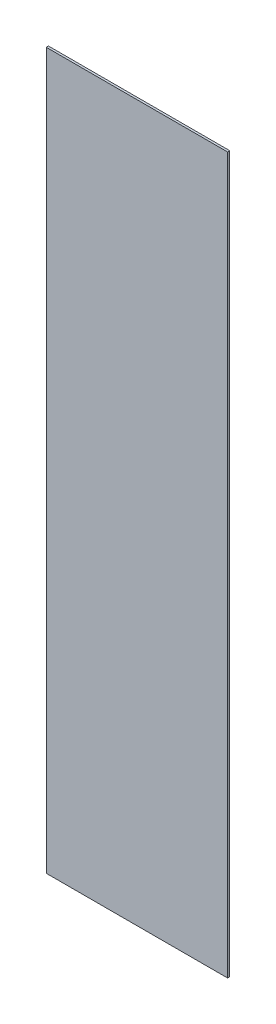
ISO-10303-21;
HEADER;
FILE_DESCRIPTION(('STEP AP214'),'2;1');
FILE_NAME('part.step','',(''),(''),'','','');
FILE_SCHEMA(('AUTOMOTIVE_DESIGN { 1 0 10303 214 1 1 1 1 }'));
ENDSEC;
DATA;
#1=APPLICATION_CONTEXT('core data for automotive mechanical design processes');
#2=APPLICATION_PROTOCOL_DEFINITION('international standard','automotive_design',2000,#1);
#3=PRODUCT_CONTEXT('',#1,'mechanical');
#4=PRODUCT('Part','Part','',(#3));
#5=PRODUCT_RELATED_PRODUCT_CATEGORY('part','',(#4));
#6=PRODUCT_DEFINITION_FORMATION('','',#4);
#7=PRODUCT_DEFINITION_CONTEXT('part definition',#1,'design');
#8=PRODUCT_DEFINITION('design','',#6,#7);
#9=PRODUCT_DEFINITION_SHAPE('','',#8);
#10=(LENGTH_UNIT() NAMED_UNIT(*) SI_UNIT(.MILLI.,.METRE.));
#11=(NAMED_UNIT(*) PLANE_ANGLE_UNIT() SI_UNIT($,.RADIAN.));
#12=(NAMED_UNIT(*) SI_UNIT($,.STERADIAN.) SOLID_ANGLE_UNIT());
#13=UNCERTAINTY_MEASURE_WITH_UNIT(LENGTH_MEASURE(1.E-05),#10,'distance_accuracy_value','');
#14=(GEOMETRIC_REPRESENTATION_CONTEXT(3) GLOBAL_UNCERTAINTY_ASSIGNED_CONTEXT((#13)) GLOBAL_UNIT_ASSIGNED_CONTEXT((#10,
#11,#12)) REPRESENTATION_CONTEXT('',''));
#15=CARTESIAN_POINT('',(0.,0.,0.));
#16=DIRECTION('',(0.,0.,1.));
#17=DIRECTION('',(1.,0.,0.));
#18=AXIS2_PLACEMENT_3D('',#15,#16,#17);
#19=CARTESIAN_POINT('',(0.,0.,1.));
#20=DIRECTION('',(1.,0.,0.));
#21=DIRECTION('',(0.,0.,-1.));
#22=AXIS2_PLACEMENT_3D('',#19,#20,#21);
#23=PLANE('',#22);
#24=DIRECTION('',(0.,-1.,0.));
#25=VECTOR('',#24,1.);
#26=CARTESIAN_POINT('',(0.,0.,0.));
#27=LINE('',#26,#25);
#28=CARTESIAN_POINT('',(0.,327.5,0.));
#29=VERTEX_POINT('',#28);
#30=CARTESIAN_POINT('',(0.,0.,0.));
#31=VERTEX_POINT('',#30);
#32=EDGE_CURVE('E104',#29,#31,#27,.T.);
#33=ORIENTED_EDGE('',*,*,#32,.T.);
#34=DIRECTION('',(0.,0.,-1.));
#35=VECTOR('',#34,1.);
#36=CARTESIAN_POINT('',(0.,0.,1.));
#37=LINE('',#36,#35);
#38=CARTESIAN_POINT('',(0.,0.,1.));
#39=VERTEX_POINT('',#38);
#40=EDGE_CURVE('E11',#39,#31,#37,.T.);
#41=ORIENTED_EDGE('',*,*,#40,.F.);
#42=DIRECTION('',(0.,-1.,0.));
#43=VECTOR('',#42,1.);
#44=CARTESIAN_POINT('',(0.,0.,1.));
#45=LINE('',#44,#43);
#46=CARTESIAN_POINT('',(0.,327.5,1.));
#47=VERTEX_POINT('',#46);
#48=EDGE_CURVE('E92',#47,#39,#45,.T.);
#49=ORIENTED_EDGE('',*,*,#48,.F.);
#50=DIRECTION('',(0.,0.,-1.));
#51=VECTOR('',#50,1.);
#52=CARTESIAN_POINT('',(0.,327.5,1.));
#53=LINE('',#52,#51);
#54=EDGE_CURVE('E100',#47,#29,#53,.T.);
#55=ORIENTED_EDGE('',*,*,#54,.T.);
#56=EDGE_LOOP('',(#33,#41,#49,#55));
#57=FACE_BOUND('',#56,.T.);
#58=ADVANCED_FACE('F41',(#57),#23,.F.);
#59=CARTESIAN_POINT('',(0.,0.,1.));
#60=DIRECTION('',(0.,1.,0.));
#61=DIRECTION('',(0.,0.,1.));
#62=AXIS2_PLACEMENT_3D('',#59,#60,#61);
#63=PLANE('',#62);
#64=DIRECTION('',(1.,0.,0.));
#65=VECTOR('',#64,1.);
#66=CARTESIAN_POINT('',(0.,0.,0.));
#67=LINE('',#66,#65);
#68=CARTESIAN_POINT('',(83.,0.,0.));
#69=VERTEX_POINT('',#68);
#70=EDGE_CURVE('E96',#31,#69,#67,.T.);
#71=ORIENTED_EDGE('',*,*,#70,.T.);
#72=DIRECTION('',(0.,0.,-1.));
#73=VECTOR('',#72,1.);
#74=CARTESIAN_POINT('',(83.,0.,1.));
#75=LINE('',#74,#73);
#76=CARTESIAN_POINT('',(83.,0.,1.));
#77=VERTEX_POINT('',#76);
#78=EDGE_CURVE('E49',#77,#69,#75,.T.);
#79=ORIENTED_EDGE('',*,*,#78,.F.);
#80=DIRECTION('',(1.,0.,0.));
#81=VECTOR('',#80,1.);
#82=CARTESIAN_POINT('',(0.,0.,1.));
#83=LINE('',#82,#81);
#84=EDGE_CURVE('E87',#39,#77,#83,.T.);
#85=ORIENTED_EDGE('',*,*,#84,.F.);
#86=ORIENTED_EDGE('',*,*,#40,.T.);
#87=EDGE_LOOP('',(#71,#79,#85,#86));
#88=FACE_BOUND('',#87,.T.);
#89=ADVANCED_FACE('F95',(#88),#63,.F.);
#90=CARTESIAN_POINT('',(83.,0.,1.));
#91=DIRECTION('',(-1.,0.,0.));
#92=DIRECTION('',(0.,0.,1.));
#93=AXIS2_PLACEMENT_3D('',#90,#91,#92);
#94=PLANE('',#93);
#95=DIRECTION('',(0.,1.,0.));
#96=VECTOR('',#95,1.);
#97=CARTESIAN_POINT('',(83.,0.,0.));
#98=LINE('',#97,#96);
#99=CARTESIAN_POINT('',(83.,327.5,0.));
#100=VERTEX_POINT('',#99);
#101=EDGE_CURVE('E74',#69,#100,#98,.T.);
#102=ORIENTED_EDGE('',*,*,#101,.T.);
#103=DIRECTION('',(0.,0.,-1.));
#104=VECTOR('',#103,1.);
#105=CARTESIAN_POINT('',(83.,327.5,1.));
#106=LINE('',#105,#104);
#107=CARTESIAN_POINT('',(83.,327.5,1.));
#108=VERTEX_POINT('',#107);
#109=EDGE_CURVE('E97',#108,#100,#106,.T.);
#110=ORIENTED_EDGE('',*,*,#109,.F.);
#111=DIRECTION('',(0.,1.,0.));
#112=VECTOR('',#111,1.);
#113=CARTESIAN_POINT('',(83.,0.,1.));
#114=LINE('',#113,#112);
#115=EDGE_CURVE('E90',#77,#108,#114,.T.);
#116=ORIENTED_EDGE('',*,*,#115,.F.);
#117=ORIENTED_EDGE('',*,*,#78,.T.);
#118=EDGE_LOOP('',(#102,#110,#116,#117));
#119=FACE_BOUND('',#118,.T.);
#120=ADVANCED_FACE('F98',(#119),#94,.F.);
#121=CARTESIAN_POINT('',(0.,327.5,1.));
#122=DIRECTION('',(0.,-1.,0.));
#123=DIRECTION('',(0.,0.,-1.));
#124=AXIS2_PLACEMENT_3D('',#121,#122,#123);
#125=PLANE('',#124);
#126=DIRECTION('',(-1.,0.,0.));
#127=VECTOR('',#126,1.);
#128=CARTESIAN_POINT('',(0.,327.5,0.));
#129=LINE('',#128,#127);
#130=EDGE_CURVE('E80',#100,#29,#129,.T.);
#131=ORIENTED_EDGE('',*,*,#130,.T.);
#132=ORIENTED_EDGE('',*,*,#54,.F.);
#133=DIRECTION('',(-1.,0.,0.));
#134=VECTOR('',#133,1.);
#135=CARTESIAN_POINT('',(0.,327.5,1.));
#136=LINE('',#135,#134);
#137=EDGE_CURVE('E57',#108,#47,#136,.T.);
#138=ORIENTED_EDGE('',*,*,#137,.F.);
#139=ORIENTED_EDGE('',*,*,#109,.T.);
#140=EDGE_LOOP('',(#131,#132,#138,#139));
#141=FACE_BOUND('',#140,.T.);
#142=ADVANCED_FACE('F111',(#141),#125,.F.);
#143=CARTESIAN_POINT('',(0.,0.,1.));
#144=DIRECTION('',(0.,0.,-1.));
#145=DIRECTION('',(-1.,0.,0.));
#146=AXIS2_PLACEMENT_3D('',#143,#144,#145);
#147=PLANE('',#146);
#148=ORIENTED_EDGE('',*,*,#48,.T.);
#149=ORIENTED_EDGE('',*,*,#84,.T.);
#150=ORIENTED_EDGE('',*,*,#115,.T.);
#151=ORIENTED_EDGE('',*,*,#137,.T.);
#152=EDGE_LOOP('',(#148,#149,#150,#151));
#153=FACE_BOUND('',#152,.T.);
#154=ADVANCED_FACE('F88',(#153),#147,.F.);
#155=CARTESIAN_POINT('',(0.,0.,0.));
#156=DIRECTION('',(0.,0.,-1.));
#157=DIRECTION('',(-1.,0.,0.));
#158=AXIS2_PLACEMENT_3D('',#155,#156,#157);
#159=PLANE('',#158);
#160=ORIENTED_EDGE('',*,*,#32,.F.);
#161=ORIENTED_EDGE('',*,*,#130,.F.);
#162=ORIENTED_EDGE('',*,*,#101,.F.);
#163=ORIENTED_EDGE('',*,*,#70,.F.);
#164=EDGE_LOOP('',(#160,#161,#162,#163));
#165=FACE_BOUND('',#164,.T.);
#166=ADVANCED_FACE('F114',(#165),#159,.T.);
#167=CLOSED_SHELL('',(#58,#89,#120,#142,#154,#166));
#168=MANIFOLD_SOLID_BREP('B2',#167);
#169=ADVANCED_BREP_SHAPE_REPRESENTATION('',(#18,#168),#14);
#170=SHAPE_DEFINITION_REPRESENTATION(#9,#169);
ENDSEC;
END-ISO-10303-21;
